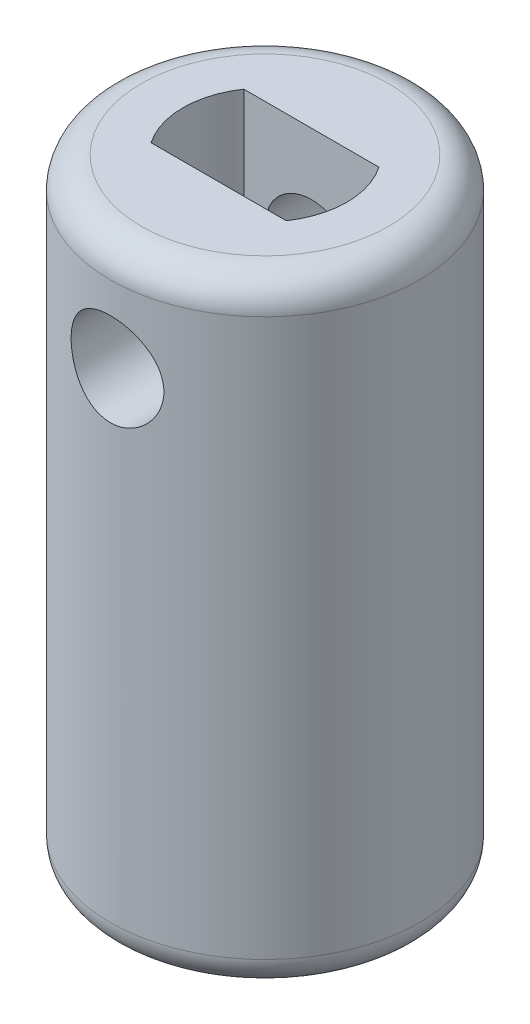
ISO-10303-21;
HEADER;
FILE_DESCRIPTION(('STEP AP214'),'2;1');
FILE_NAME('part.step','',(''),(''),'','','');
FILE_SCHEMA(('AUTOMOTIVE_DESIGN { 1 0 10303 214 1 1 1 1 }'));
ENDSEC;
DATA;
#1=APPLICATION_CONTEXT('core data for automotive mechanical design processes');
#2=APPLICATION_PROTOCOL_DEFINITION('international standard','automotive_design',2000,#1);
#3=PRODUCT_CONTEXT('',#1,'mechanical');
#4=PRODUCT('Part','Part','',(#3));
#5=PRODUCT_RELATED_PRODUCT_CATEGORY('part','',(#4));
#6=PRODUCT_DEFINITION_FORMATION('','',#4);
#7=PRODUCT_DEFINITION_CONTEXT('part definition',#1,'design');
#8=PRODUCT_DEFINITION('design','',#6,#7);
#9=PRODUCT_DEFINITION_SHAPE('','',#8);
#10=(LENGTH_UNIT() NAMED_UNIT(*) SI_UNIT(.MILLI.,.METRE.));
#11=(NAMED_UNIT(*) PLANE_ANGLE_UNIT() SI_UNIT($,.RADIAN.));
#12=(NAMED_UNIT(*) SI_UNIT($,.STERADIAN.) SOLID_ANGLE_UNIT());
#13=UNCERTAINTY_MEASURE_WITH_UNIT(LENGTH_MEASURE(1.E-05),#10,'distance_accuracy_value','');
#14=(GEOMETRIC_REPRESENTATION_CONTEXT(3) GLOBAL_UNCERTAINTY_ASSIGNED_CONTEXT((#13)) GLOBAL_UNIT_ASSIGNED_CONTEXT((#10,
#11,#12)) REPRESENTATION_CONTEXT('',''));
#15=CARTESIAN_POINT('',(0.,0.,0.));
#16=DIRECTION('',(0.,0.,1.));
#17=DIRECTION('',(1.,0.,0.));
#18=AXIS2_PLACEMENT_3D('',#15,#16,#17);
#19=CARTESIAN_POINT('',(0.,20.,0.));
#20=DIRECTION('',(0.,-1.,0.));
#21=DIRECTION('',(0.,0.,-1.));
#22=AXIS2_PLACEMENT_3D('',#19,#20,#21);
#23=CYLINDRICAL_SURFACE('',#22,5.);
#24=CARTESIAN_POINT('',(0.,19.,0.));
#25=DIRECTION('',(0.,1.,0.));
#26=DIRECTION('',(0.,0.,1.));
#27=AXIS2_PLACEMENT_3D('',#24,#25,#26);
#28=CIRCLE('',#27,5.);
#29=CARTESIAN_POINT('',(0.,19.,5.));
#30=VERTEX_POINT('',#29);
#31=EDGE_CURVE('E54',#30,#30,#28,.F.);
#32=ORIENTED_EDGE('',*,*,#31,.T.);
#33=EDGE_LOOP('',(#32));
#34=FACE_BOUND('',#33,.T.);
#35=CARTESIAN_POINT('',(0.,1.,0.));
#36=DIRECTION('',(0.,1.,0.));
#37=DIRECTION('',(0.,0.,1.));
#38=AXIS2_PLACEMENT_3D('',#35,#36,#37);
#39=CIRCLE('',#38,5.);
#40=CARTESIAN_POINT('',(0.,1.,5.));
#41=VERTEX_POINT('',#40);
#42=EDGE_CURVE('E169',#41,#41,#39,.T.);
#43=ORIENTED_EDGE('',*,*,#42,.T.);
#44=EDGE_LOOP('',(#43));
#45=FACE_BOUND('',#44,.T.);
#46=CARTESIAN_POINT('',(0.,18.,-5.));
#47=CARTESIAN_POINT('',(0.0822886127532997,17.9999990025151,-4.9999992925055));
#48=CARTESIAN_POINT('',(0.164587318351529,17.993206136376,-4.99794915693954));
#49=CARTESIAN_POINT('',(0.32678812530488,17.9662786457779,-4.98997105593691));
#50=CARTESIAN_POINT('',(0.406689504411419,17.9461400419767,-4.98404193389692));
#51=CARTESIAN_POINT('',(0.561732707754526,17.8932539830897,-4.96895552501836));
#52=CARTESIAN_POINT('',(0.636881364395372,17.8605251303811,-4.95980300250425));
#53=CARTESIAN_POINT('',(0.78062418105313,17.7834639069442,-4.93922109237645));
#54=CARTESIAN_POINT('',(0.849217467469668,17.7391299926046,-4.92779140192067));
#55=CARTESIAN_POINT('',(0.979871797183743,17.6387759925273,-4.90350737192774));
#56=CARTESIAN_POINT('',(1.04171807124434,17.5824833741141,-4.89062383657036));
#57=CARTESIAN_POINT('',(1.15524920923324,17.4603907700898,-4.86505834210442));
#58=CARTESIAN_POINT('',(1.20693236327441,17.394589187875,-4.85237641724501));
#59=CARTESIAN_POINT('',(1.29980037723707,17.2535292469624,-4.82834113993772));
#60=CARTESIAN_POINT('',(1.34072309022213,17.1780915390093,-4.81702406663875));
#61=CARTESIAN_POINT('',(1.4092139477476,17.0210107457697,-4.79743620394031));
#62=CARTESIAN_POINT('',(1.43678529919973,16.939369156072,-4.78916468313311));
#63=CARTESIAN_POINT('',(1.47701633682652,16.7746097338695,-4.77690870838434));
#64=CARTESIAN_POINT('',(1.49007196234677,16.6915972561361,-4.77281069324533));
#65=CARTESIAN_POINT('',(1.50213730614672,16.5244668437832,-4.76902789749767));
#66=CARTESIAN_POINT('',(1.50115042761078,16.4403491819409,-4.76934204760571));
#67=CARTESIAN_POINT('',(1.48546977199812,16.2766160913915,-4.77424744067778));
#68=CARTESIAN_POINT('',(1.47127205262685,16.1969477496378,-4.7786838859914));
#69=CARTESIAN_POINT('',(1.43037420427056,16.0411802137265,-4.79108356228624));
#70=CARTESIAN_POINT('',(1.40367284141641,15.9650813726257,-4.79904714132351));
#71=CARTESIAN_POINT('',(1.33816026653682,15.8173996503393,-4.81772733074973));
#72=CARTESIAN_POINT('',(1.29918816934642,15.7458929160447,-4.82848016115952));
#73=CARTESIAN_POINT('',(1.21035222588683,15.6102679779898,-4.85150987000065));
#74=CARTESIAN_POINT('',(1.16048574002588,15.5461515705862,-4.86378711746991));
#75=CARTESIAN_POINT('',(1.04881290765546,15.424313809238,-4.88911011297937));
#76=CARTESIAN_POINT('',(0.986594907466973,15.3669713359703,-4.90216654310498));
#77=CARTESIAN_POINT('',(0.853263259313967,15.2634460159358,-4.92712244063259));
#78=CARTESIAN_POINT('',(0.782149051860889,15.2172638715856,-4.9390218351841));
#79=CARTESIAN_POINT('',(0.632355038342804,15.1371400775353,-4.9604316006947));
#80=CARTESIAN_POINT('',(0.553627749747951,15.1032824837501,-4.96992543668314));
#81=CARTESIAN_POINT('',(0.391245415603519,15.0494004099004,-4.98533521832222));
#82=CARTESIAN_POINT('',(0.307591751589582,15.0293720714675,-4.99125216186999));
#83=CARTESIAN_POINT('',(0.140952242668332,15.0043478221006,-4.99868364643538));
#84=CARTESIAN_POINT('',(0.0580500976011871,14.9988384141984,-5.0003485041779));
#85=CARTESIAN_POINT('',(-0.107499605823383,15.0015691557121,-4.9995292324176));
#86=CARTESIAN_POINT('',(-0.19014719669078,15.0098074696514,-4.99704565677756));
#87=CARTESIAN_POINT('',(-0.350903605309697,15.0393846111115,-4.98830696987163));
#88=CARTESIAN_POINT('',(-0.429072772614169,15.0604233875809,-4.98213829799417));
#89=CARTESIAN_POINT('',(-0.580754638954522,15.1146432327782,-4.96674347841533));
#90=CARTESIAN_POINT('',(-0.654266777025584,15.1478257610379,-4.95751696321085));
#91=CARTESIAN_POINT('',(-0.796437189461052,15.2262531654811,-4.93669654351325));
#92=CARTESIAN_POINT('',(-0.864943826199669,15.271759340948,-4.92505280829675));
#93=CARTESIAN_POINT('',(-0.993523307980146,15.3732247540528,-4.90073468764318));
#94=CARTESIAN_POINT('',(-1.05359403235593,15.4291866118877,-4.8880600443108));
#95=CARTESIAN_POINT('',(-1.16585744551027,15.5523873083693,-4.86253171869138));
#96=CARTESIAN_POINT('',(-1.21768481231504,15.6199618757717,-4.84968825033268));
#97=CARTESIAN_POINT('',(-1.30928995072154,15.7631279390135,-4.82576515238463));
#98=CARTESIAN_POINT('',(-1.34906803829472,15.8387192245582,-4.81468547654651));
#99=CARTESIAN_POINT('',(-1.41517347127168,15.9955324912547,-4.79567189615055));
#100=CARTESIAN_POINT('',(-1.4415634693705,16.0767261865366,-4.78772337843827));
#101=CARTESIAN_POINT('',(-1.48021730815114,16.2426879689315,-4.77591594362794));
#102=CARTESIAN_POINT('',(-1.49248598978779,16.3274548207877,-4.772055625083));
#103=CARTESIAN_POINT('',(-1.50221984485059,16.4943615183762,-4.76899972496087));
#104=CARTESIAN_POINT('',(-1.5002805530849,16.5764636510176,-4.76961647442754));
#105=CARTESIAN_POINT('',(-1.48307505444814,16.7391141033728,-4.77499401288294));
#106=CARTESIAN_POINT('',(-1.46780938124716,16.8196624851763,-4.77975463592551));
#107=CARTESIAN_POINT('',(-1.42476888804136,16.9759453991429,-4.79275763670385));
#108=CARTESIAN_POINT('',(-1.39715175507069,17.0517272873617,-4.80095604545965));
#109=CARTESIAN_POINT('',(-1.33031507121129,17.1976424388177,-4.81990278909136));
#110=CARTESIAN_POINT('',(-1.29109329962876,17.2677746176408,-4.83065161194312));
#111=CARTESIAN_POINT('',(-1.20048763805072,17.4031631165271,-4.85397676425833));
#112=CARTESIAN_POINT('',(-1.14871276092994,17.4681487612604,-4.86660540163797));
#113=CARTESIAN_POINT('',(-1.03517434629782,17.5887024983079,-4.89201320450026));
#114=CARTESIAN_POINT('',(-0.973408217134502,17.6442681394678,-4.90479240823905));
#115=CARTESIAN_POINT('',(-0.839465762183249,17.746023412295,-4.92950936570649));
#116=CARTESIAN_POINT('',(-0.767037885790608,17.7918914468555,-4.94141159765674));
#117=CARTESIAN_POINT('',(-0.61514137398353,17.870735169904,-4.96260680455813));
#118=CARTESIAN_POINT('',(-0.535676052998956,17.9037168882745,-4.97190099931067));
#119=CARTESIAN_POINT('',(-0.380757712655282,17.9528952756527,-4.98602174969301));
#120=CARTESIAN_POINT('',(-0.305786961954235,17.9705116728832,-4.99122027381068));
#121=CARTESIAN_POINT('',(-0.15388019523078,17.9940635252416,-4.99820944494492));
#122=CARTESIAN_POINT('',(-0.07694450985814,18.0000009327048,-5.0000006615474));
#123=CARTESIAN_POINT('',(0.,18.,-5.));
#124=B_SPLINE_CURVE_WITH_KNOTS('',3,(#46,#47,#48,#49,#50,#51,#52,#53,#54,#55,#56,#57,#58,#59,
#60,#61,#62,#63,#64,#65,#66,#67,#68,#69,#70,#71,#72,#73,#74,#75,#76,#77,#78,#79,#80,#81,#82,#83,
#84,#85,#86,#87,#88,#89,#90,#91,#92,#93,#94,#95,#96,#97,#98,#99,#100,#101,#102,#103,#104,#105,
#106,#107,#108,#109,#110,#111,#112,#113,#114,#115,#116,#117,#118,#119,#120,#121,#122,#123),
.UNSPECIFIED.,.T.,.F.,(4,2,2,2,2,2,2,2,2,2,2,2,2,2,2,2,2,2,2,2,2,2,2,2,2,2,2,2,2,2,2,2,2,2,2,2,
2,2,4),(0.,0.24658320361261,0.493239964845999,0.739533676300873,0.985860164412701,
1.23855602948191,1.49129437288633,1.74971481004109,2.00807314543224,2.25919689356599,
2.51025978319089,2.75226016697676,2.99428443658001,3.2396242644712,3.48502360158555,
3.74067104048167,3.99633456531072,4.25371046881689,4.51101453528808,4.75908809438545,
5.00712853550327,5.24956746682327,5.49203554593729,5.74011305702908,5.98825282000191,
6.24540400322819,6.50254844252681,6.75847814951252,7.01432009460283,7.25950155466942,
7.504673196616,7.74680040402721,7.98897397553107,8.23996925679931,8.49102974897502,
8.74942996156671,9.00770911595235,9.23831691930459,9.46888616948874),.UNSPECIFIED.);
#125=CARTESIAN_POINT('',(0.,18.,-5.));
#126=VERTEX_POINT('',#125);
#127=EDGE_CURVE('E112',#126,#126,#124,.T.);
#128=ORIENTED_EDGE('',*,*,#127,.F.);
#129=EDGE_LOOP('',(#128));
#130=FACE_BOUND('',#129,.T.);
#131=CARTESIAN_POINT('',(0.,15.,5.));
#132=CARTESIAN_POINT('',(0.0822886127532998,15.0000009974849,4.9999992925055));
#133=CARTESIAN_POINT('',(0.164587318351529,15.006793863624,4.99794915693954));
#134=CARTESIAN_POINT('',(0.326788125304881,15.0337213542221,4.98997105593691));
#135=CARTESIAN_POINT('',(0.40668950441142,15.0538599580233,4.98404193389692));
#136=CARTESIAN_POINT('',(0.561732707754527,15.1067460169103,4.96895552501836));
#137=CARTESIAN_POINT('',(0.636881364395373,15.1394748696189,4.95980300250425));
#138=CARTESIAN_POINT('',(0.780624181053132,15.2165360930558,4.93922109237645));
#139=CARTESIAN_POINT('',(0.84921746746967,15.2608700073954,4.92779140192067));
#140=CARTESIAN_POINT('',(0.979871797183746,15.3612240074727,4.90350737192774));
#141=CARTESIAN_POINT('',(1.04171807124434,15.4175166258859,4.89062383657036));
#142=CARTESIAN_POINT('',(1.15524920923324,15.5396092299102,4.86505834210442));
#143=CARTESIAN_POINT('',(1.20693236327441,15.605410812125,4.85237641724501));
#144=CARTESIAN_POINT('',(1.29980037723708,15.7464707530376,4.82834113993772));
#145=CARTESIAN_POINT('',(1.34072309022214,15.8219084609907,4.81702406663875));
#146=CARTESIAN_POINT('',(1.4092139477476,15.9789892542303,4.79743620394031));
#147=CARTESIAN_POINT('',(1.43678529919973,16.060630843928,4.78916468313311));
#148=CARTESIAN_POINT('',(1.47701633682652,16.2253902661305,4.77690870838434));
#149=CARTESIAN_POINT('',(1.49007196234677,16.3084027438639,4.77281069324533));
#150=CARTESIAN_POINT('',(1.50213730614672,16.4755331562168,4.76902789749767));
#151=CARTESIAN_POINT('',(1.50115042761078,16.5596508180591,4.76934204760571));
#152=CARTESIAN_POINT('',(1.48546977199812,16.7233839086085,4.77424744067778));
#153=CARTESIAN_POINT('',(1.47127205262685,16.8030522503622,4.7786838859914));
#154=CARTESIAN_POINT('',(1.43037420427056,16.9588197862735,4.79108356228624));
#155=CARTESIAN_POINT('',(1.40367284141641,17.0349186273743,4.79904714132351));
#156=CARTESIAN_POINT('',(1.33816026653682,17.1826003496607,4.81772733074973));
#157=CARTESIAN_POINT('',(1.29918816934642,17.2541070839553,4.82848016115952));
#158=CARTESIAN_POINT('',(1.21035222588683,17.3897320220102,4.85150987000065));
#159=CARTESIAN_POINT('',(1.16048574002588,17.4538484294138,4.86378711746991));
#160=CARTESIAN_POINT('',(1.04881290765546,17.575686190762,4.88911011297937));
#161=CARTESIAN_POINT('',(0.986594907466973,17.6330286640297,4.90216654310498));
#162=CARTESIAN_POINT('',(0.853263259313968,17.7365539840643,4.92712244063259));
#163=CARTESIAN_POINT('',(0.782149051860889,17.7827361284144,4.9390218351841));
#164=CARTESIAN_POINT('',(0.632355038342804,17.8628599224647,4.9604316006947));
#165=CARTESIAN_POINT('',(0.553627749747951,17.8967175162499,4.96992543668314));
#166=CARTESIAN_POINT('',(0.39124541560352,17.9505995900996,4.98533521832222));
#167=CARTESIAN_POINT('',(0.307591751589583,17.9706279285325,4.99125216186999));
#168=CARTESIAN_POINT('',(0.140952242668332,17.9956521778994,4.99868364643538));
#169=CARTESIAN_POINT('',(0.0580500976011876,18.0011615858016,5.0003485041779));
#170=CARTESIAN_POINT('',(-0.107499605823383,17.9984308442879,4.9995292324176));
#171=CARTESIAN_POINT('',(-0.19014719669078,17.9901925303486,4.99704565677756));
#172=CARTESIAN_POINT('',(-0.350903605309697,17.9606153888885,4.98830696987163));
#173=CARTESIAN_POINT('',(-0.429072772614169,17.9395766124191,4.98213829799417));
#174=CARTESIAN_POINT('',(-0.580754638954522,17.8853567672218,4.96674347841533));
#175=CARTESIAN_POINT('',(-0.654266777025584,17.8521742389621,4.95751696321085));
#176=CARTESIAN_POINT('',(-0.796437189461052,17.7737468345189,4.93669654351325));
#177=CARTESIAN_POINT('',(-0.864943826199669,17.728240659052,4.92505280829675));
#178=CARTESIAN_POINT('',(-0.993523307980145,17.6267752459472,4.90073468764318));
#179=CARTESIAN_POINT('',(-1.05359403235593,17.5708133881123,4.8880600443108));
#180=CARTESIAN_POINT('',(-1.16585744551027,17.4476126916307,4.86253171869138));
#181=CARTESIAN_POINT('',(-1.21768481231504,17.3800381242283,4.84968825033268));
#182=CARTESIAN_POINT('',(-1.30928995072154,17.2368720609865,4.82576515238463));
#183=CARTESIAN_POINT('',(-1.34906803829472,17.1612807754418,4.81468547654651));
#184=CARTESIAN_POINT('',(-1.41517347127168,17.0044675087453,4.79567189615055));
#185=CARTESIAN_POINT('',(-1.4415634693705,16.9232738134634,4.78772337843827));
#186=CARTESIAN_POINT('',(-1.48021730815114,16.7573120310685,4.77591594362794));
#187=CARTESIAN_POINT('',(-1.49248598978779,16.6725451792123,4.772055625083));
#188=CARTESIAN_POINT('',(-1.50221984485059,16.5056384816238,4.76899972496087));
#189=CARTESIAN_POINT('',(-1.5002805530849,16.4235363489824,4.76961647442754));
#190=CARTESIAN_POINT('',(-1.48307505444813,16.2608858966272,4.77499401288294));
#191=CARTESIAN_POINT('',(-1.46780938124716,16.1803375148237,4.77975463592551));
#192=CARTESIAN_POINT('',(-1.42476888804136,16.0240546008572,4.79275763670385));
#193=CARTESIAN_POINT('',(-1.39715175507069,15.9482727126383,4.80095604545965));
#194=CARTESIAN_POINT('',(-1.33031507121129,15.8023575611823,4.81990278909136));
#195=CARTESIAN_POINT('',(-1.29109329962876,15.7322253823592,4.83065161194312));
#196=CARTESIAN_POINT('',(-1.20048763805072,15.5968368834729,4.85397676425833));
#197=CARTESIAN_POINT('',(-1.14871276092994,15.5318512387396,4.86660540163798));
#198=CARTESIAN_POINT('',(-1.03517434629782,15.4112975016921,4.89201320450026));
#199=CARTESIAN_POINT('',(-0.973408217134502,15.3557318605322,4.90479240823905));
#200=CARTESIAN_POINT('',(-0.839465762183249,15.253976587705,4.92950936570649));
#201=CARTESIAN_POINT('',(-0.767037885790608,15.2081085531445,4.94141159765674));
#202=CARTESIAN_POINT('',(-0.61514137398353,15.129264830096,4.96260680455813));
#203=CARTESIAN_POINT('',(-0.535676052998955,15.0962831117255,4.97190099931067));
#204=CARTESIAN_POINT('',(-0.380757712655282,15.0471047243473,4.98602174969301));
#205=CARTESIAN_POINT('',(-0.305786961954234,15.0294883271168,4.99122027381068));
#206=CARTESIAN_POINT('',(-0.15388019523078,15.0059364747584,4.99820944494492));
#207=CARTESIAN_POINT('',(-0.0769445098581396,14.9999990672952,5.0000006615474));
#208=CARTESIAN_POINT('',(0.,15.,5.));
#209=B_SPLINE_CURVE_WITH_KNOTS('',3,(#131,#132,#133,#134,#135,#136,#137,#138,#139,#140,#141,
#142,#143,#144,#145,#146,#147,#148,#149,#150,#151,#152,#153,#154,#155,#156,#157,#158,#159,#160,
#161,#162,#163,#164,#165,#166,#167,#168,#169,#170,#171,#172,#173,#174,#175,#176,#177,#178,#179,
#180,#181,#182,#183,#184,#185,#186,#187,#188,#189,#190,#191,#192,#193,#194,#195,#196,#197,#198,
#199,#200,#201,#202,#203,#204,#205,#206,#207,#208),.UNSPECIFIED.,.T.,.F.,(4,2,2,2,2,2,2,2,2,2,2,
2,2,2,2,2,2,2,2,2,2,2,2,2,2,2,2,2,2,2,2,2,2,2,2,2,2,2,4),(0.,0.24658320361261,0.493239964846,
0.739533676300875,0.985860164412703,1.23855602948192,1.49129437288633,1.74971481004109,
2.00807314543223,2.25919689356599,2.5102597831909,2.75226016697676,2.99428443658001,
3.2396242644712,3.48502360158555,3.74067104048167,3.99633456531071,4.25371046881689,
4.51101453528808,4.75908809438545,5.00712853550327,5.24956746682327,5.49203554593729,
5.74011305702908,5.98825282000191,6.24540400322819,6.50254844252681,6.75847814951252,
7.01432009460283,7.25950155466943,7.504673196616,7.74680040402721,7.98897397553107,
8.23996925679931,8.49102974897502,8.74942996156671,9.00770911595235,9.2383169193046,
9.46888616948875),.UNSPECIFIED.);
#210=CARTESIAN_POINT('',(0.,15.,5.));
#211=VERTEX_POINT('',#210);
#212=EDGE_CURVE('E114',#211,#211,#209,.T.);
#213=ORIENTED_EDGE('',*,*,#212,.F.);
#214=EDGE_LOOP('',(#213));
#215=FACE_BOUND('',#214,.T.);
#216=ADVANCED_FACE('F46',(#34,#45,#130,#215),#23,.T.);
#217=CARTESIAN_POINT('',(0.,20.,0.));
#218=DIRECTION('',(0.,1.,0.));
#219=DIRECTION('',(0.,0.,1.));
#220=AXIS2_PLACEMENT_3D('',#217,#218,#219);
#221=PLANE('',#220);
#222=CARTESIAN_POINT('',(0.,20.,0.));
#223=DIRECTION('',(0.,1.,0.));
#224=DIRECTION('',(0.,0.,1.));
#225=AXIS2_PLACEMENT_3D('',#222,#223,#224);
#226=CIRCLE('',#225,4.);
#227=CARTESIAN_POINT('',(0.,20.,4.));
#228=VERTEX_POINT('',#227);
#229=EDGE_CURVE('E270',#228,#228,#226,.T.);
#230=ORIENTED_EDGE('',*,*,#229,.T.);
#231=EDGE_LOOP('',(#230));
#232=FACE_BOUND('',#231,.T.);
#233=DIRECTION('',(1.,0.,0.));
#234=VECTOR('',#233,1.);
#235=CARTESIAN_POINT('',(0.,20.,1.5));
#236=LINE('',#235,#234);
#237=CARTESIAN_POINT('',(-2.18460522749535,20.,1.5));
#238=VERTEX_POINT('',#237);
#239=CARTESIAN_POINT('',(2.18460522749535,20.,1.5));
#240=VERTEX_POINT('',#239);
#241=EDGE_CURVE('E61',#238,#240,#236,.T.);
#242=ORIENTED_EDGE('',*,*,#241,.F.);
#243=CARTESIAN_POINT('',(0.,20.,0.));
#244=DIRECTION('',(0.,1.,0.));
#245=DIRECTION('',(0.,0.,1.));
#246=AXIS2_PLACEMENT_3D('',#243,#244,#245);
#247=CIRCLE('',#246,2.65);
#248=CARTESIAN_POINT('',(-2.18460522749535,20.,-1.5));
#249=VERTEX_POINT('',#248);
#250=EDGE_CURVE('E89',#249,#238,#247,.T.);
#251=ORIENTED_EDGE('',*,*,#250,.F.);
#252=DIRECTION('',(1.,0.,0.));
#253=VECTOR('',#252,1.);
#254=CARTESIAN_POINT('',(0.,20.,-1.5));
#255=LINE('',#254,#253);
#256=CARTESIAN_POINT('',(2.18460522749535,20.,-1.5));
#257=VERTEX_POINT('',#256);
#258=EDGE_CURVE('E96',#249,#257,#255,.T.);
#259=ORIENTED_EDGE('',*,*,#258,.T.);
#260=EDGE_CURVE('E102',#240,#257,#247,.T.);
#261=ORIENTED_EDGE('',*,*,#260,.F.);
#262=EDGE_LOOP('',(#242,#251,#259,#261));
#263=FACE_BOUND('',#262,.T.);
#264=ADVANCED_FACE('F104',(#232,#263),#221,.T.);
#265=CARTESIAN_POINT('',(0.,0.,0.));
#266=DIRECTION('',(0.,1.,0.));
#267=DIRECTION('',(0.,0.,1.));
#268=AXIS2_PLACEMENT_3D('',#265,#266,#267);
#269=PLANE('',#268);
#270=CARTESIAN_POINT('',(0.,0.,0.));
#271=DIRECTION('',(0.,1.,0.));
#272=DIRECTION('',(0.,0.,1.));
#273=AXIS2_PLACEMENT_3D('',#270,#271,#272);
#274=CIRCLE('',#273,4.);
#275=CARTESIAN_POINT('',(0.,0.,4.));
#276=VERTEX_POINT('',#275);
#277=EDGE_CURVE('E12',#276,#276,#274,.F.);
#278=ORIENTED_EDGE('',*,*,#277,.T.);
#279=EDGE_LOOP('',(#278));
#280=FACE_BOUND('',#279,.T.);
#281=CARTESIAN_POINT('',(0.,0.,0.));
#282=DIRECTION('',(0.,-1.,0.));
#283=DIRECTION('',(0.,0.,-1.));
#284=AXIS2_PLACEMENT_3D('',#281,#282,#283);
#285=CIRCLE('',#284,3.175);
#286=CARTESIAN_POINT('',(0.,0.,-3.175));
#287=VERTEX_POINT('',#286);
#288=EDGE_CURVE('E184',#287,#287,#285,.T.);
#289=ORIENTED_EDGE('',*,*,#288,.F.);
#290=EDGE_LOOP('',(#289));
#291=FACE_BOUND('',#290,.T.);
#292=ADVANCED_FACE('F149',(#280,#291),#269,.F.);
#293=CARTESIAN_POINT('',(0.,13.,1.5));
#294=DIRECTION('',(0.,0.,1.));
#295=DIRECTION('',(1.,0.,0.));
#296=AXIS2_PLACEMENT_3D('',#293,#294,#295);
#297=PLANE('',#296);
#298=CARTESIAN_POINT('',(0.,16.5,1.5));
#299=DIRECTION('',(0.,0.,1.));
#300=DIRECTION('',(1.,0.,0.));
#301=AXIS2_PLACEMENT_3D('',#298,#299,#300);
#302=CIRCLE('',#301,1.5);
#303=CARTESIAN_POINT('',(1.5,16.5,1.5));
#304=VERTEX_POINT('',#303);
#305=EDGE_CURVE('E175',#304,#304,#302,.F.);
#306=ORIENTED_EDGE('',*,*,#305,.F.);
#307=EDGE_LOOP('',(#306));
#308=FACE_BOUND('',#307,.T.);
#309=ORIENTED_EDGE('',*,*,#241,.T.);
#310=DIRECTION('',(0.,1.,0.));
#311=VECTOR('',#310,1.);
#312=CARTESIAN_POINT('',(2.18460522749535,13.,1.5));
#313=LINE('',#312,#311);
#314=CARTESIAN_POINT('',(2.18460522749535,13.,1.5));
#315=VERTEX_POINT('',#314);
#316=EDGE_CURVE('E275',#315,#240,#313,.T.);
#317=ORIENTED_EDGE('',*,*,#316,.F.);
#318=DIRECTION('',(1.,0.,0.));
#319=VECTOR('',#318,1.);
#320=CARTESIAN_POINT('',(0.,13.,1.5));
#321=LINE('',#320,#319);
#322=CARTESIAN_POINT('',(-2.18460522749535,13.,1.5));
#323=VERTEX_POINT('',#322);
#324=EDGE_CURVE('E105',#323,#315,#321,.T.);
#325=ORIENTED_EDGE('',*,*,#324,.F.);
#326=DIRECTION('',(0.,1.,0.));
#327=VECTOR('',#326,1.);
#328=CARTESIAN_POINT('',(-2.18460522749535,13.,1.5));
#329=LINE('',#328,#327);
#330=EDGE_CURVE('E92',#323,#238,#329,.T.);
#331=ORIENTED_EDGE('',*,*,#330,.T.);
#332=EDGE_LOOP('',(#309,#317,#325,#331));
#333=FACE_BOUND('',#332,.T.);
#334=ADVANCED_FACE('F143',(#308,#333),#297,.F.);
#335=CARTESIAN_POINT('',(0.,13.,0.));
#336=DIRECTION('',(0.,1.,0.));
#337=DIRECTION('',(0.,0.,1.));
#338=AXIS2_PLACEMENT_3D('',#335,#336,#337);
#339=CYLINDRICAL_SURFACE('',#338,2.65);
#340=ORIENTED_EDGE('',*,*,#250,.T.);
#341=ORIENTED_EDGE('',*,*,#330,.F.);
#342=CARTESIAN_POINT('',(0.,13.,0.));
#343=DIRECTION('',(0.,1.,0.));
#344=DIRECTION('',(0.,0.,1.));
#345=AXIS2_PLACEMENT_3D('',#342,#343,#344);
#346=CIRCLE('',#345,2.65);
#347=CARTESIAN_POINT('',(-2.18460522749535,13.,-1.5));
#348=VERTEX_POINT('',#347);
#349=EDGE_CURVE('E90',#348,#323,#346,.T.);
#350=ORIENTED_EDGE('',*,*,#349,.F.);
#351=DIRECTION('',(0.,1.,0.));
#352=VECTOR('',#351,1.);
#353=CARTESIAN_POINT('',(-2.18460522749535,13.,-1.5));
#354=LINE('',#353,#352);
#355=EDGE_CURVE('E84',#348,#249,#354,.T.);
#356=ORIENTED_EDGE('',*,*,#355,.T.);
#357=EDGE_LOOP('',(#340,#341,#350,#356));
#358=FACE_BOUND('',#357,.T.);
#359=ADVANCED_FACE('F86',(#358),#339,.F.);
#360=CARTESIAN_POINT('',(0.,13.,-1.5));
#361=DIRECTION('',(0.,0.,1.));
#362=DIRECTION('',(1.,0.,0.));
#363=AXIS2_PLACEMENT_3D('',#360,#361,#362);
#364=PLANE('',#363);
#365=CARTESIAN_POINT('',(0.,16.5,-1.5));
#366=DIRECTION('',(0.,0.,1.));
#367=DIRECTION('',(1.,0.,0.));
#368=AXIS2_PLACEMENT_3D('',#365,#366,#367);
#369=CIRCLE('',#368,1.5);
#370=CARTESIAN_POINT('',(1.5,16.5,-1.5));
#371=VERTEX_POINT('',#370);
#372=EDGE_CURVE('E177',#371,#371,#369,.F.);
#373=ORIENTED_EDGE('',*,*,#372,.T.);
#374=EDGE_LOOP('',(#373));
#375=FACE_BOUND('',#374,.T.);
#376=ORIENTED_EDGE('',*,*,#258,.F.);
#377=ORIENTED_EDGE('',*,*,#355,.F.);
#378=DIRECTION('',(1.,0.,0.));
#379=VECTOR('',#378,1.);
#380=CARTESIAN_POINT('',(0.,13.,-1.5));
#381=LINE('',#380,#379);
#382=CARTESIAN_POINT('',(2.18460522749535,13.,-1.5));
#383=VERTEX_POINT('',#382);
#384=EDGE_CURVE('E70',#348,#383,#381,.T.);
#385=ORIENTED_EDGE('',*,*,#384,.T.);
#386=DIRECTION('',(0.,1.,0.));
#387=VECTOR('',#386,1.);
#388=CARTESIAN_POINT('',(2.18460522749535,13.,-1.5));
#389=LINE('',#388,#387);
#390=EDGE_CURVE('E93',#383,#257,#389,.T.);
#391=ORIENTED_EDGE('',*,*,#390,.T.);
#392=EDGE_LOOP('',(#376,#377,#385,#391));
#393=FACE_BOUND('',#392,.T.);
#394=ADVANCED_FACE('F97',(#375,#393),#364,.T.);
#395=ORIENTED_EDGE('',*,*,#260,.T.);
#396=ORIENTED_EDGE('',*,*,#390,.F.);
#397=EDGE_CURVE('E108',#315,#383,#346,.T.);
#398=ORIENTED_EDGE('',*,*,#397,.F.);
#399=ORIENTED_EDGE('',*,*,#316,.T.);
#400=EDGE_LOOP('',(#395,#396,#398,#399));
#401=FACE_BOUND('',#400,.T.);
#402=ADVANCED_FACE('F136',(#401),#339,.F.);
#403=CARTESIAN_POINT('',(0.,16.5,5.));
#404=DIRECTION('',(0.,0.,-1.));
#405=DIRECTION('',(-1.,0.,0.));
#406=AXIS2_PLACEMENT_3D('',#403,#404,#405);
#407=CYLINDRICAL_SURFACE('',#406,1.5);
#408=ORIENTED_EDGE('',*,*,#372,.F.);
#409=EDGE_LOOP('',(#408));
#410=FACE_BOUND('',#409,.T.);
#411=ORIENTED_EDGE('',*,*,#127,.T.);
#412=EDGE_LOOP('',(#411));
#413=FACE_BOUND('',#412,.T.);
#414=ADVANCED_FACE('F130',(#410,#413),#407,.F.);
#415=ORIENTED_EDGE('',*,*,#305,.T.);
#416=EDGE_LOOP('',(#415));
#417=FACE_BOUND('',#416,.T.);
#418=ORIENTED_EDGE('',*,*,#212,.T.);
#419=EDGE_LOOP('',(#418));
#420=FACE_BOUND('',#419,.T.);
#421=ADVANCED_FACE('F135',(#417,#420),#407,.F.);
#422=CARTESIAN_POINT('',(0.,13.,0.));
#423=DIRECTION('',(0.,-1.,0.));
#424=DIRECTION('',(0.,0.,-1.));
#425=AXIS2_PLACEMENT_3D('',#422,#423,#424);
#426=PLANE('',#425);
#427=CARTESIAN_POINT('',(0.,13.,0.));
#428=DIRECTION('',(0.,-1.,0.));
#429=DIRECTION('',(0.,0.,-1.));
#430=AXIS2_PLACEMENT_3D('',#427,#428,#429);
#431=CIRCLE('',#430,3.175);
#432=CARTESIAN_POINT('',(0.,13.,-3.175));
#433=VERTEX_POINT('',#432);
#434=EDGE_CURVE('E181',#433,#433,#431,.T.);
#435=ORIENTED_EDGE('',*,*,#434,.T.);
#436=EDGE_LOOP('',(#435));
#437=FACE_BOUND('',#436,.T.);
#438=ORIENTED_EDGE('',*,*,#324,.T.);
#439=ORIENTED_EDGE('',*,*,#397,.T.);
#440=ORIENTED_EDGE('',*,*,#384,.F.);
#441=ORIENTED_EDGE('',*,*,#349,.T.);
#442=EDGE_LOOP('',(#438,#439,#440,#441));
#443=FACE_BOUND('',#442,.T.);
#444=ADVANCED_FACE('F190',(#437,#443),#426,.T.);
#445=CARTESIAN_POINT('',(0.,13.,0.));
#446=DIRECTION('',(0.,-1.,0.));
#447=DIRECTION('',(0.,0.,-1.));
#448=AXIS2_PLACEMENT_3D('',#445,#446,#447);
#449=CYLINDRICAL_SURFACE('',#448,3.175);
#450=CARTESIAN_POINT('',(0.,13.,-3.175));
#451=CARTESIAN_POINT('',(0.,12.8645833333333,-3.175));
#452=CARTESIAN_POINT('',(0.,12.7291666666667,-3.175));
#453=CARTESIAN_POINT('',(0.,12.4583333333333,-3.175));
#454=CARTESIAN_POINT('',(0.,12.3229166666667,-3.175));
#455=CARTESIAN_POINT('',(0.,12.0520833333333,-3.175));
#456=CARTESIAN_POINT('',(0.,11.9166666666667,-3.175));
#457=CARTESIAN_POINT('',(0.,11.6458333333333,-3.175));
#458=CARTESIAN_POINT('',(0.,11.5104166666667,-3.175));
#459=CARTESIAN_POINT('',(0.,11.2395833333333,-3.175));
#460=CARTESIAN_POINT('',(0.,11.1041666666667,-3.175));
#461=CARTESIAN_POINT('',(0.,10.8333333333333,-3.175));
#462=CARTESIAN_POINT('',(0.,10.6979166666667,-3.175));
#463=CARTESIAN_POINT('',(0.,10.4270833333333,-3.175));
#464=CARTESIAN_POINT('',(0.,10.2916666666667,-3.175));
#465=CARTESIAN_POINT('',(0.,10.0208333333333,-3.175));
#466=CARTESIAN_POINT('',(0.,9.88541666666667,-3.175));
#467=CARTESIAN_POINT('',(0.,9.61458333333334,-3.175));
#468=CARTESIAN_POINT('',(0.,9.47916666666667,-3.175));
#469=CARTESIAN_POINT('',(0.,9.20833333333334,-3.175));
#470=CARTESIAN_POINT('',(0.,9.07291666666667,-3.175));
#471=CARTESIAN_POINT('',(0.,8.80208333333334,-3.175));
#472=CARTESIAN_POINT('',(0.,8.66666666666667,-3.175));
#473=CARTESIAN_POINT('',(0.,8.39583333333334,-3.175));
#474=CARTESIAN_POINT('',(0.,8.26041666666667,-3.175));
#475=CARTESIAN_POINT('',(0.,7.98958333333334,-3.175));
#476=CARTESIAN_POINT('',(0.,7.85416666666667,-3.175));
#477=CARTESIAN_POINT('',(0.,7.58333333333334,-3.175));
#478=CARTESIAN_POINT('',(0.,7.44791666666667,-3.175));
#479=CARTESIAN_POINT('',(0.,7.17708333333334,-3.175));
#480=CARTESIAN_POINT('',(0.,7.04166666666667,-3.175));
#481=CARTESIAN_POINT('',(0.,6.77083333333334,-3.175));
#482=CARTESIAN_POINT('',(0.,6.63541666666667,-3.175));
#483=CARTESIAN_POINT('',(0.,6.36458333333334,-3.175));
#484=CARTESIAN_POINT('',(0.,6.22916666666667,-3.175));
#485=CARTESIAN_POINT('',(0.,5.95833333333334,-3.175));
#486=CARTESIAN_POINT('',(0.,5.82291666666667,-3.175));
#487=CARTESIAN_POINT('',(0.,5.55208333333334,-3.175));
#488=CARTESIAN_POINT('',(0.,5.41666666666667,-3.175));
#489=CARTESIAN_POINT('',(0.,5.14583333333334,-3.175));
#490=CARTESIAN_POINT('',(0.,5.01041666666667,-3.175));
#491=CARTESIAN_POINT('',(0.,4.73958333333334,-3.175));
#492=CARTESIAN_POINT('',(0.,4.60416666666667,-3.175));
#493=CARTESIAN_POINT('',(0.,4.33333333333334,-3.175));
#494=CARTESIAN_POINT('',(0.,4.19791666666667,-3.175));
#495=CARTESIAN_POINT('',(0.,3.92708333333334,-3.175));
#496=CARTESIAN_POINT('',(0.,3.79166666666667,-3.175));
#497=CARTESIAN_POINT('',(0.,3.52083333333334,-3.175));
#498=CARTESIAN_POINT('',(0.,3.38541666666667,-3.175));
#499=CARTESIAN_POINT('',(0.,3.11458333333334,-3.175));
#500=CARTESIAN_POINT('',(0.,2.97916666666667,-3.175));
#501=CARTESIAN_POINT('',(0.,2.70833333333334,-3.175));
#502=CARTESIAN_POINT('',(0.,2.57291666666667,-3.175));
#503=CARTESIAN_POINT('',(0.,2.30208333333334,-3.175));
#504=CARTESIAN_POINT('',(0.,2.16666666666667,-3.175));
#505=CARTESIAN_POINT('',(0.,1.89583333333334,-3.175));
#506=CARTESIAN_POINT('',(0.,1.76041666666667,-3.175));
#507=CARTESIAN_POINT('',(0.,1.48958333333334,-3.175));
#508=CARTESIAN_POINT('',(0.,1.35416666666667,-3.175));
#509=CARTESIAN_POINT('',(0.,1.08333333333334,-3.175));
#510=CARTESIAN_POINT('',(0.,0.947916666666669,-3.175));
#511=CARTESIAN_POINT('',(0.,0.677083333333336,-3.175));
#512=CARTESIAN_POINT('',(0.,0.541666666666669,-3.175));
#513=CARTESIAN_POINT('',(0.,0.270833333333335,-3.175));
#514=CARTESIAN_POINT('',(0.,0.135416666666668,-3.175));
#515=CARTESIAN_POINT('',(0.,0.,-3.175));
#516=B_SPLINE_CURVE_WITH_KNOTS('',3,(#450,#451,#452,#453,#454,#455,#456,#457,#458,#459,#460,
#461,#462,#463,#464,#465,#466,#467,#468,#469,#470,#471,#472,#473,#474,#475,#476,#477,#478,#479,
#480,#481,#482,#483,#484,#485,#486,#487,#488,#489,#490,#491,#492,#493,#494,#495,#496,#497,#498,
#499,#500,#501,#502,#503,#504,#505,#506,#507,#508,#509,#510,#511,#512,#513,#514,#515),
.UNSPECIFIED.,.F.,.F.,(4,2,2,2,2,2,2,2,2,2,2,2,2,2,2,2,2,2,2,2,2,2,2,2,2,2,2,2,2,2,2,2,4),(0.,
0.406249999999999,0.812499999999999,1.21875,1.625,2.03125,2.4375,2.84375,3.25,3.65625,4.0625,
4.46875,4.875,5.28125,5.6875,6.09375,6.5,6.90625,7.3125,7.71875,8.125,8.53125,8.9375,9.34375,
9.75,10.15625,10.5625,10.96875,11.375,11.78125,12.1875,12.59375,13.),.UNSPECIFIED.);
#517=EDGE_CURVE('BSEAM138',#433,#287,#516,.T.);
#518=ORIENTED_EDGE('',*,*,#434,.F.);
#519=ORIENTED_EDGE('',*,*,#288,.T.);
#520=ORIENTED_EDGE('',*,*,#517,.T.);
#521=ORIENTED_EDGE('',*,*,#517,.F.);
#522=EDGE_LOOP('',(#518,#520,#519,#521));
#523=FACE_BOUND('',#522,.T.);
#524=ADVANCED_FACE('F138',(#523),#449,.F.);
#525=CARTESIAN_POINT('',(0.,19.,0.));
#526=DIRECTION('',(0.,1.,0.));
#527=DIRECTION('',(0.,0.,1.));
#528=AXIS2_PLACEMENT_3D('',#525,#526,#527);
#529=TOROIDAL_SURFACE('',#528,4.,1.);
#530=ORIENTED_EDGE('',*,*,#31,.F.);
#531=EDGE_LOOP('',(#530));
#532=FACE_BOUND('',#531,.T.);
#533=ORIENTED_EDGE('',*,*,#229,.F.);
#534=EDGE_LOOP('',(#533));
#535=FACE_BOUND('',#534,.T.);
#536=ADVANCED_FACE('F194',(#532,#535),#529,.T.);
#537=CARTESIAN_POINT('',(0.,1.,0.));
#538=DIRECTION('',(0.,1.,0.));
#539=DIRECTION('',(0.,0.,1.));
#540=AXIS2_PLACEMENT_3D('',#537,#538,#539);
#541=TOROIDAL_SURFACE('',#540,4.,1.);
#542=ORIENTED_EDGE('',*,*,#277,.F.);
#543=EDGE_LOOP('',(#542));
#544=FACE_BOUND('',#543,.T.);
#545=ORIENTED_EDGE('',*,*,#42,.F.);
#546=EDGE_LOOP('',(#545));
#547=FACE_BOUND('',#546,.T.);
#548=ADVANCED_FACE('F48',(#544,#547),#541,.T.);
#549=CLOSED_SHELL('',(#216,#264,#292,#334,#359,#394,#402,#414,#421,#444,#524,#536,#548));
#550=MANIFOLD_SOLID_BREP('B2',#549);
#551=ADVANCED_BREP_SHAPE_REPRESENTATION('',(#18,#550),#14);
#552=SHAPE_DEFINITION_REPRESENTATION(#9,#551);
ENDSEC;
END-ISO-10303-21;
